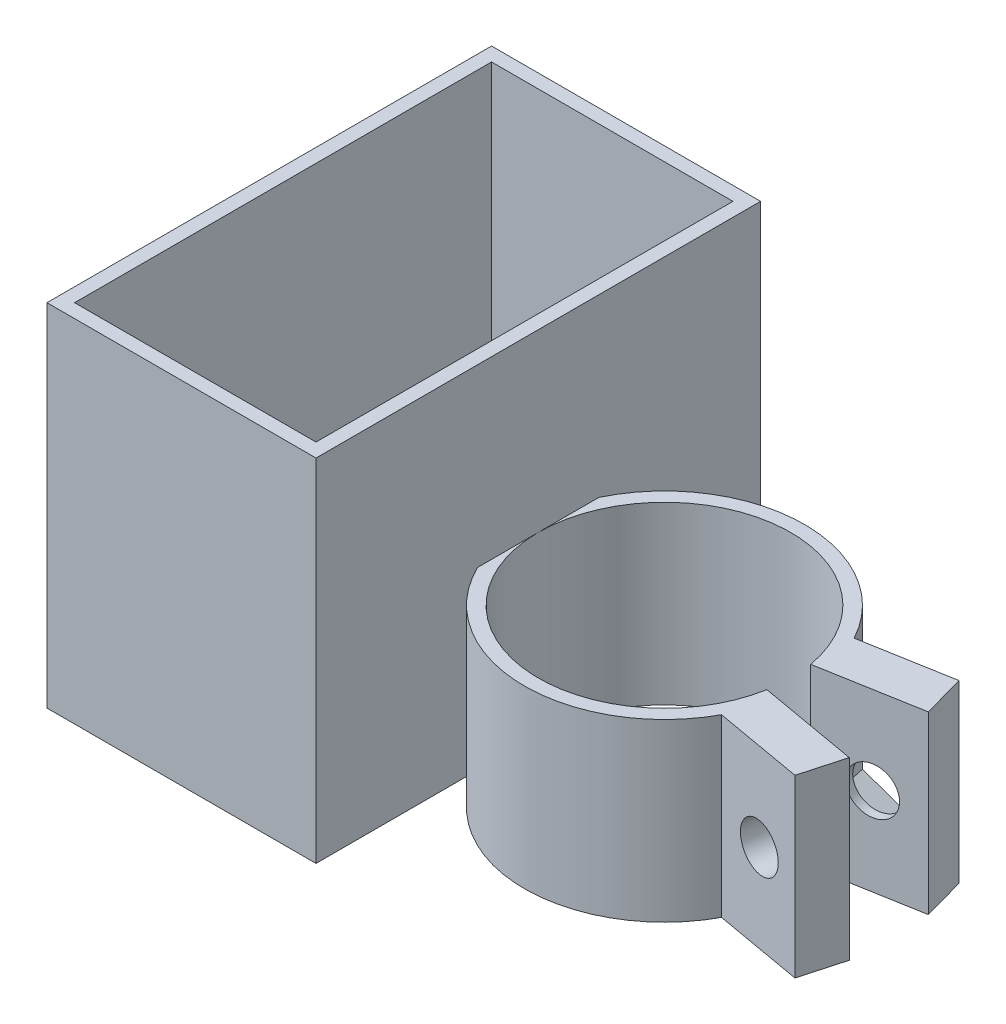
ISO-10303-21;
HEADER;
FILE_DESCRIPTION(('STEP AP214'),'2;1');
FILE_NAME('part.step','',(''),(''),'','','');
FILE_SCHEMA(('AUTOMOTIVE_DESIGN { 1 0 10303 214 1 1 1 1 }'));
ENDSEC;
DATA;
#1=APPLICATION_CONTEXT('core data for automotive mechanical design processes');
#2=APPLICATION_PROTOCOL_DEFINITION('international standard','automotive_design',2000,#1);
#3=PRODUCT_CONTEXT('',#1,'mechanical');
#4=PRODUCT('Part','Part','',(#3));
#5=PRODUCT_RELATED_PRODUCT_CATEGORY('part','',(#4));
#6=PRODUCT_DEFINITION_FORMATION('','',#4);
#7=PRODUCT_DEFINITION_CONTEXT('part definition',#1,'design');
#8=PRODUCT_DEFINITION('design','',#6,#7);
#9=PRODUCT_DEFINITION_SHAPE('','',#8);
#10=(LENGTH_UNIT() NAMED_UNIT(*) SI_UNIT(.MILLI.,.METRE.));
#11=(NAMED_UNIT(*) PLANE_ANGLE_UNIT() SI_UNIT($,.RADIAN.));
#12=(NAMED_UNIT(*) SI_UNIT($,.STERADIAN.) SOLID_ANGLE_UNIT());
#13=UNCERTAINTY_MEASURE_WITH_UNIT(LENGTH_MEASURE(1.E-05),#10,'distance_accuracy_value','');
#14=(GEOMETRIC_REPRESENTATION_CONTEXT(3) GLOBAL_UNCERTAINTY_ASSIGNED_CONTEXT((#13)) GLOBAL_UNIT_ASSIGNED_CONTEXT((#10,
#11,#12)) REPRESENTATION_CONTEXT('',''));
#15=CARTESIAN_POINT('',(0.,0.,0.));
#16=DIRECTION('',(0.,0.,1.));
#17=DIRECTION('',(1.,0.,0.));
#18=AXIS2_PLACEMENT_3D('',#15,#16,#17);
#19=CARTESIAN_POINT('',(-20.25625,50.8,-30.1625));
#20=DIRECTION('',(0.,0.,-1.));
#21=DIRECTION('',(-1.,0.,0.));
#22=AXIS2_PLACEMENT_3D('',#19,#20,#21);
#23=PLANE('',#22);
#24=DIRECTION('',(1.,0.,0.));
#25=VECTOR('',#24,1.);
#26=CARTESIAN_POINT('',(-55.18125,3.175,-30.1625));
#27=LINE('',#26,#25);
#28=CARTESIAN_POINT('',(-55.18125,3.175,-30.1625));
#29=VERTEX_POINT('',#28);
#30=CARTESIAN_POINT('',(-20.25625,3.175,-30.1625));
#31=VERTEX_POINT('',#30);
#32=EDGE_CURVE('E215',#29,#31,#27,.T.);
#33=ORIENTED_EDGE('',*,*,#32,.T.);
#34=DIRECTION('',(0.,-1.,0.));
#35=VECTOR('',#34,1.);
#36=CARTESIAN_POINT('',(-20.25625,50.8,-30.1625));
#37=LINE('',#36,#35);
#38=CARTESIAN_POINT('',(-20.25625,50.8,-30.1625));
#39=VERTEX_POINT('',#38);
#40=EDGE_CURVE('E200',#39,#31,#37,.T.);
#41=ORIENTED_EDGE('',*,*,#40,.F.);
#42=DIRECTION('',(1.,0.,0.));
#43=VECTOR('',#42,1.);
#44=CARTESIAN_POINT('',(-20.25625,50.8,-30.1625));
#45=LINE('',#44,#43);
#46=CARTESIAN_POINT('',(-55.18125,50.8,-30.1625));
#47=VERTEX_POINT('',#46);
#48=EDGE_CURVE('E272',#47,#39,#45,.T.);
#49=ORIENTED_EDGE('',*,*,#48,.F.);
#50=DIRECTION('',(0.,-1.,0.));
#51=VECTOR('',#50,1.);
#52=CARTESIAN_POINT('',(-55.18125,50.8,-30.1625));
#53=LINE('',#52,#51);
#54=EDGE_CURVE('E216',#47,#29,#53,.T.);
#55=ORIENTED_EDGE('',*,*,#54,.T.);
#56=EDGE_LOOP('',(#33,#41,#49,#55));
#57=FACE_BOUND('',#56,.T.);
#58=ADVANCED_FACE('F35',(#57),#23,.F.);
#59=CARTESIAN_POINT('',(-55.18125,50.8,-30.1625));
#60=DIRECTION('',(-1.,0.,0.));
#61=DIRECTION('',(0.,0.,1.));
#62=AXIS2_PLACEMENT_3D('',#59,#60,#61);
#63=PLANE('',#62);
#64=DIRECTION('',(0.,0.,-1.));
#65=VECTOR('',#64,1.);
#66=CARTESIAN_POINT('',(-55.18125,3.175,30.1625));
#67=LINE('',#66,#65);
#68=CARTESIAN_POINT('',(-55.18125,3.175,30.1625));
#69=VERTEX_POINT('',#68);
#70=EDGE_CURVE('E51',#69,#29,#67,.T.);
#71=ORIENTED_EDGE('',*,*,#70,.T.);
#72=ORIENTED_EDGE('',*,*,#54,.F.);
#73=DIRECTION('',(0.,0.,-1.));
#74=VECTOR('',#73,1.);
#75=CARTESIAN_POINT('',(-55.18125,50.8,-30.1625));
#76=LINE('',#75,#74);
#77=CARTESIAN_POINT('',(-55.18125,50.8,30.1625));
#78=VERTEX_POINT('',#77);
#79=EDGE_CURVE('E212',#78,#47,#76,.T.);
#80=ORIENTED_EDGE('',*,*,#79,.F.);
#81=DIRECTION('',(0.,-1.,0.));
#82=VECTOR('',#81,1.);
#83=CARTESIAN_POINT('',(-55.18125,50.8,30.1625));
#84=LINE('',#83,#82);
#85=EDGE_CURVE('E282',#78,#69,#84,.T.);
#86=ORIENTED_EDGE('',*,*,#85,.T.);
#87=EDGE_LOOP('',(#71,#72,#80,#86));
#88=FACE_BOUND('',#87,.T.);
#89=ADVANCED_FACE('F469',(#88),#63,.F.);
#90=CARTESIAN_POINT('',(-20.25625,50.8,30.1625));
#91=DIRECTION('',(0.,0.,1.));
#92=DIRECTION('',(1.,0.,0.));
#93=AXIS2_PLACEMENT_3D('',#90,#91,#92);
#94=PLANE('',#93);
#95=DIRECTION('',(-1.,0.,0.));
#96=VECTOR('',#95,1.);
#97=CARTESIAN_POINT('',(-20.25625,3.175,30.1625));
#98=LINE('',#97,#96);
#99=CARTESIAN_POINT('',(-20.25625,3.175,30.1625));
#100=VERTEX_POINT('',#99);
#101=EDGE_CURVE('E59',#100,#69,#98,.T.);
#102=ORIENTED_EDGE('',*,*,#101,.T.);
#103=ORIENTED_EDGE('',*,*,#85,.F.);
#104=DIRECTION('',(-1.,0.,0.));
#105=VECTOR('',#104,1.);
#106=CARTESIAN_POINT('',(-20.25625,50.8,30.1625));
#107=LINE('',#106,#105);
#108=CARTESIAN_POINT('',(-20.25625,50.8,30.1625));
#109=VERTEX_POINT('',#108);
#110=EDGE_CURVE('E275',#109,#78,#107,.T.);
#111=ORIENTED_EDGE('',*,*,#110,.F.);
#112=DIRECTION('',(0.,-1.,0.));
#113=VECTOR('',#112,1.);
#114=CARTESIAN_POINT('',(-20.25625,50.8,30.1625));
#115=LINE('',#114,#113);
#116=EDGE_CURVE('E211',#109,#100,#115,.T.);
#117=ORIENTED_EDGE('',*,*,#116,.T.);
#118=EDGE_LOOP('',(#102,#103,#111,#117));
#119=FACE_BOUND('',#118,.T.);
#120=ADVANCED_FACE('F474',(#119),#94,.F.);
#121=CARTESIAN_POINT('',(-20.25625,50.8,-30.1625));
#122=DIRECTION('',(1.,0.,0.));
#123=DIRECTION('',(0.,0.,-1.));
#124=AXIS2_PLACEMENT_3D('',#121,#122,#123);
#125=PLANE('',#124);
#126=DIRECTION('',(0.,0.,1.));
#127=VECTOR('',#126,1.);
#128=CARTESIAN_POINT('',(-20.25625,3.175,-30.1625));
#129=LINE('',#128,#127);
#130=EDGE_CURVE('E205',#31,#100,#129,.T.);
#131=ORIENTED_EDGE('',*,*,#130,.T.);
#132=ORIENTED_EDGE('',*,*,#116,.F.);
#133=DIRECTION('',(0.,0.,1.));
#134=VECTOR('',#133,1.);
#135=CARTESIAN_POINT('',(-20.25625,50.8,-30.1625));
#136=LINE('',#135,#134);
#137=EDGE_CURVE('E207',#39,#109,#136,.T.);
#138=ORIENTED_EDGE('',*,*,#137,.F.);
#139=ORIENTED_EDGE('',*,*,#40,.T.);
#140=EDGE_LOOP('',(#131,#132,#138,#139));
#141=FACE_BOUND('',#140,.T.);
#142=ADVANCED_FACE('F202',(#141),#125,.F.);
#143=CARTESIAN_POINT('',(30.0367584131233,12.7,20.6839281609609));
#144=DIRECTION('',(-0.173648177666931,0.,-0.984807753012208));
#145=DIRECTION('',(-0.984807753012208,0.,0.173648177666931));
#146=AXIS2_PLACEMENT_3D('',#143,#144,#145);
#147=CYLINDRICAL_SURFACE('',#146,3.3734375);
#148=CARTESIAN_POINT('',(25.5938792860573,12.7,-4.51289145912742));
#149=DIRECTION('',(-0.173648177666931,0.,-0.984807753012208));
#150=DIRECTION('',(-0.984807753012208,0.,0.173648177666931));
#151=AXIS2_PLACEMENT_3D('',#148,#149,#150);
#152=CIRCLE('',#151,3.3734375);
#153=CARTESIAN_POINT('',(22.2716918817551,12.7,-3.92710018477914));
#154=VERTEX_POINT('',#153);
#155=EDGE_CURVE('E327',#154,#154,#152,.F.);
#156=CARTESIAN_POINT('',(25.3733461004203,12.7,-5.76359730545292));
#157=DIRECTION('',(-0.173648177666931,0.,-0.984807753012208));
#158=DIRECTION('',(-0.984807753012208,0.,0.173648177666932));
#159=AXIS2_PLACEMENT_3D('',#156,#157,#158);
#160=CIRCLE('',#159,3.3734375);
#161=CARTESIAN_POINT('',(22.0511586961181,12.7,-5.17780603110463));
#162=VERTEX_POINT('',#161);
#163=EDGE_CURVE('E39',#162,#162,#160,.F.);
#164=CARTESIAN_POINT('',(22.2716918817551,12.7,-3.92710018477914));
#165=CARTESIAN_POINT('',(22.2693946610714,12.7,-3.94012837067836));
#166=CARTESIAN_POINT('',(22.2670974403877,12.7,-3.95315655657758));
#167=CARTESIAN_POINT('',(22.2625029990203,12.7,-3.97921292837603));
#168=CARTESIAN_POINT('',(22.2602057783365,12.7,-3.99224111427525));
#169=CARTESIAN_POINT('',(22.2556113369691,12.7,-4.0182974860737));
#170=CARTESIAN_POINT('',(22.2533141162854,12.7,-4.03132567197293));
#171=CARTESIAN_POINT('',(22.248719674918,12.7,-4.05738204377138));
#172=CARTESIAN_POINT('',(22.2464224542342,12.7,-4.0704102296706));
#173=CARTESIAN_POINT('',(22.2418280128668,12.7,-4.09646660146905));
#174=CARTESIAN_POINT('',(22.2395307921831,12.7,-4.10949478736827));
#175=CARTESIAN_POINT('',(22.2349363508156,12.7,-4.13555115916672));
#176=CARTESIAN_POINT('',(22.2326391301319,12.7,-4.14857934506594));
#177=CARTESIAN_POINT('',(22.2280446887645,12.7,-4.17463571686439));
#178=CARTESIAN_POINT('',(22.2257474680808,12.7,-4.18766390276361));
#179=CARTESIAN_POINT('',(22.2211530267133,12.7,-4.21372027456206));
#180=CARTESIAN_POINT('',(22.2188558060296,12.7,-4.22674846046129));
#181=CARTESIAN_POINT('',(22.2142613646622,12.7,-4.25280483225974));
#182=CARTESIAN_POINT('',(22.2119641439785,12.7,-4.26583301815896));
#183=CARTESIAN_POINT('',(22.207369702611,12.7,-4.29188938995741));
#184=CARTESIAN_POINT('',(22.2050724819273,12.7,-4.30491757585663));
#185=CARTESIAN_POINT('',(22.2004780405599,12.7,-4.33097394765508));
#186=CARTESIAN_POINT('',(22.1981808198761,12.7,-4.3440021335543));
#187=CARTESIAN_POINT('',(22.1935863785087,12.7,-4.37005850535275));
#188=CARTESIAN_POINT('',(22.191289157825,12.7,-4.38308669125197));
#189=CARTESIAN_POINT('',(22.1866947164575,12.7,-4.40914306305042));
#190=CARTESIAN_POINT('',(22.1843974957738,12.7,-4.42217124894965));
#191=CARTESIAN_POINT('',(22.1798030544064,12.7,-4.44822762074809));
#192=CARTESIAN_POINT('',(22.1775058337227,12.7,-4.46125580664732));
#193=CARTESIAN_POINT('',(22.1729113923552,12.7,-4.48731217844576));
#194=CARTESIAN_POINT('',(22.1706141716715,12.7,-4.50034036434499));
#195=CARTESIAN_POINT('',(22.1660197303041,12.7,-4.52639673614344));
#196=CARTESIAN_POINT('',(22.1637225096204,12.7,-4.53942492204266));
#197=CARTESIAN_POINT('',(22.1591280682529,12.7,-4.56548129384111));
#198=CARTESIAN_POINT('',(22.1568308475692,12.7,-4.57850947974033));
#199=CARTESIAN_POINT('',(22.1522364062018,12.7,-4.60456585153878));
#200=CARTESIAN_POINT('',(22.1499391855181,12.7,-4.617594037438));
#201=CARTESIAN_POINT('',(22.1453447441506,12.7,-4.64365040923645));
#202=CARTESIAN_POINT('',(22.1430475234669,12.7,-4.65667859513568));
#203=CARTESIAN_POINT('',(22.1384530820995,12.7,-4.68273496693412));
#204=CARTESIAN_POINT('',(22.1361558614157,12.7,-4.69576315283335));
#205=CARTESIAN_POINT('',(22.1315614200483,12.7,-4.72181952463179));
#206=CARTESIAN_POINT('',(22.1292641993646,12.7,-4.73484771053102));
#207=CARTESIAN_POINT('',(22.1246697579971,12.7,-4.76090408232947));
#208=CARTESIAN_POINT('',(22.1223725373134,12.7,-4.77393226822869));
#209=CARTESIAN_POINT('',(22.117778095946,12.7,-4.79998864002714));
#210=CARTESIAN_POINT('',(22.1154808752623,12.7,-4.81301682592636));
#211=CARTESIAN_POINT('',(22.1108864338948,12.7,-4.83907319772481));
#212=CARTESIAN_POINT('',(22.1085892132111,12.7,-4.85210138362403));
#213=CARTESIAN_POINT('',(22.1039947718437,12.7,-4.87815775542248));
#214=CARTESIAN_POINT('',(22.10169755116,12.7,-4.89118594132171));
#215=CARTESIAN_POINT('',(22.0971031097925,12.7,-4.91724231312015));
#216=CARTESIAN_POINT('',(22.0948058891088,12.7,-4.93027049901938));
#217=CARTESIAN_POINT('',(22.0902114477414,12.7,-4.95632687081783));
#218=CARTESIAN_POINT('',(22.0879142270576,12.7,-4.96935505671705));
#219=CARTESIAN_POINT('',(22.0833197856902,12.7,-4.9954114285155));
#220=CARTESIAN_POINT('',(22.0810225650065,12.7,-5.00843961441472));
#221=CARTESIAN_POINT('',(22.076428123639,12.7,-5.03449598621317));
#222=CARTESIAN_POINT('',(22.0741309029553,12.7,-5.04752417211239));
#223=CARTESIAN_POINT('',(22.0695364615879,12.7,-5.07358054391084));
#224=CARTESIAN_POINT('',(22.0672392409042,12.7,-5.08660872981006));
#225=CARTESIAN_POINT('',(22.0626447995367,12.7,-5.11266510160851));
#226=CARTESIAN_POINT('',(22.060347578853,12.7,-5.12569328750774));
#227=CARTESIAN_POINT('',(22.0557531374856,12.7,-5.15174965930619));
#228=CARTESIAN_POINT('',(22.0534559168019,12.7,-5.16477784520541));
#229=CARTESIAN_POINT('',(22.0511586961181,12.7,-5.17780603110463));
#230=B_SPLINE_CURVE_WITH_KNOTS('',3,(#164,#165,#166,#167,#168,#169,#170,#171,#172,#173,#174,
#175,#176,#177,#178,#179,#180,#181,#182,#183,#184,#185,#186,#187,#188,#189,#190,#191,#192,#193,
#194,#195,#196,#197,#198,#199,#200,#201,#202,#203,#204,#205,#206,#207,#208,#209,#210,#211,#212,
#213,#214,#215,#216,#217,#218,#219,#220,#221,#222,#223,#224,#225,#226,#227,#228,#229),
.UNSPECIFIED.,.F.,.F.,(4,2,2,2,2,2,2,2,2,2,2,2,2,2,2,2,2,2,2,2,2,2,2,2,2,2,2,2,2,2,2,2,4),(0.,
0.0396874999999995,0.0793749999999984,0.119062500000001,0.15875,0.198437499999999,
0.238124999999998,0.277812499999997,0.317499999999999,0.357187499999998,0.396874999999997,
0.436562499999996,0.476249999999999,0.515937499999998,0.555624999999997,0.595312499999996,
0.634999999999995,0.674687499999998,0.714374999999997,0.754062499999996,0.793749999999995,
0.833437499999997,0.873124999999996,0.912812499999995,0.952499999999994,0.992187499999994,
1.031875,1.0715625,1.11124999999999,1.15093749999999,1.19062499999999,1.2303125,
1.26999999999999),.UNSPECIFIED.);
#231=EDGE_CURVE('BSEAM493',#154,#162,#230,.T.);
#232=ORIENTED_EDGE('',*,*,#155,.T.);
#233=ORIENTED_EDGE('',*,*,#163,.F.);
#234=ORIENTED_EDGE('',*,*,#231,.T.);
#235=ORIENTED_EDGE('',*,*,#231,.F.);
#236=EDGE_LOOP('',(#232,#234,#233,#235));
#237=FACE_BOUND('',#236,.T.);
#238=ADVANCED_FACE('F493',(#237),#147,.F.);
#239=CARTESIAN_POINT('',(0.,25.4,0.));
#240=DIRECTION('',(0.,-1.,0.));
#241=DIRECTION('',(0.,0.,-1.));
#242=AXIS2_PLACEMENT_3D('',#239,#240,#241);
#243=CYLINDRICAL_SURFACE('',#242,20.25625);
#244=CARTESIAN_POINT('',(0.,0.,0.));
#245=DIRECTION('',(0.,1.,0.));
#246=DIRECTION('',(0.,0.,1.));
#247=AXIS2_PLACEMENT_3D('',#244,#245,#246);
#248=CIRCLE('',#247,20.25625);
#249=CARTESIAN_POINT('',(17.8403144349107,0.,-9.59368776467195));
#250=VERTEX_POINT('',#249);
#251=CARTESIAN_POINT('',(-18.25625,0.,-8.77638877899105));
#252=VERTEX_POINT('',#251);
#253=EDGE_CURVE('E364',#250,#252,#248,.T.);
#254=ORIENTED_EDGE('',*,*,#253,.T.);
#255=DIRECTION('',(0.,-1.,0.));
#256=VECTOR('',#255,1.);
#257=CARTESIAN_POINT('',(-18.25625,25.4,-8.77638877899105));
#258=LINE('',#257,#256);
#259=CARTESIAN_POINT('',(-18.25625,25.4,-8.77638877899105));
#260=VERTEX_POINT('',#259);
#261=EDGE_CURVE('E322',#252,#260,#258,.F.);
#262=ORIENTED_EDGE('',*,*,#261,.T.);
#263=CARTESIAN_POINT('',(0.,25.4,0.));
#264=DIRECTION('',(0.,1.,0.));
#265=DIRECTION('',(0.,0.,1.));
#266=AXIS2_PLACEMENT_3D('',#263,#264,#265);
#267=CIRCLE('',#266,20.25625);
#268=CARTESIAN_POINT('',(17.8403144349107,25.4,-9.59368776467195));
#269=VERTEX_POINT('',#268);
#270=EDGE_CURVE('E342',#269,#260,#267,.T.);
#271=ORIENTED_EDGE('',*,*,#270,.F.);
#272=DIRECTION('',(0.,-1.,0.));
#273=VECTOR('',#272,1.);
#274=CARTESIAN_POINT('',(17.8403144349107,25.4,-9.59368776467195));
#275=LINE('',#274,#273);
#276=EDGE_CURVE('E11',#269,#250,#275,.T.);
#277=ORIENTED_EDGE('',*,*,#276,.T.);
#278=EDGE_LOOP('',(#254,#262,#271,#277));
#279=FACE_BOUND('',#278,.T.);
#280=ADVANCED_FACE('F438',(#279),#243,.T.);
#281=CARTESIAN_POINT('',(0.,25.4,0.));
#282=DIRECTION('',(0.,1.,0.));
#283=DIRECTION('',(0.,0.,1.));
#284=AXIS2_PLACEMENT_3D('',#281,#282,#283);
#285=PLANE('',#284);
#286=DIRECTION('',(0.,0.,-1.));
#287=VECTOR('',#286,1.);
#288=CARTESIAN_POINT('',(-18.25625,25.4,0.));
#289=LINE('',#288,#287);
#290=CARTESIAN_POINT('',(-18.25625,25.4,8.77638877899105));
#291=VERTEX_POINT('',#290);
#292=CARTESIAN_POINT('',(-18.25625,25.4,0.));
#293=VERTEX_POINT('',#292);
#294=EDGE_CURVE('E321',#291,#293,#289,.T.);
#295=ORIENTED_EDGE('',*,*,#294,.F.);
#296=CARTESIAN_POINT('',(17.8403144349107,25.4,9.59368776467195));
#297=VERTEX_POINT('',#296);
#298=EDGE_CURVE('E340',#291,#297,#267,.T.);
#299=ORIENTED_EDGE('',*,*,#298,.T.);
#300=DIRECTION('',(-0.984807753012208,0.,-0.173648177666931));
#301=VECTOR('',#300,1.);
#302=CARTESIAN_POINT('',(-1.10266592818501,25.4,6.25352923162753));
#303=LINE('',#302,#301);
#304=CARTESIAN_POINT('',(30.7447425894998,25.4,11.8690866189399));
#305=VERTEX_POINT('',#304);
#306=EDGE_CURVE('E344',#305,#297,#303,.T.);
#307=ORIENTED_EDGE('',*,*,#306,.F.);
#308=DIRECTION('',(0.268156623818466,0.,-0.963375329299169));
#309=VECTOR('',#308,1.);
#310=CARTESIAN_POINT('',(31.6001565498542,25.4,8.79593968708785));
#311=LINE('',#310,#309);
#312=CARTESIAN_POINT('',(32.4555705102086,25.4,5.72279275523579));
#313=VERTEX_POINT('',#312);
#314=EDGE_CURVE('E347',#305,#313,#311,.T.);
#315=ORIENTED_EDGE('',*,*,#314,.T.);
#316=DIRECTION('',(0.984807753012208,0.,0.173648177666931));
#317=VECTOR('',#316,1.);
#318=CARTESIAN_POINT('',(0.,25.4,0.));
#319=LINE('',#318,#317);
#320=CARTESIAN_POINT('',(17.9788965409291,25.4,3.1701645435319));
#321=VERTEX_POINT('',#320);
#322=EDGE_CURVE('E349',#321,#313,#319,.T.);
#323=ORIENTED_EDGE('',*,*,#322,.F.);
#324=CARTESIAN_POINT('',(0.,25.4,0.));
#325=DIRECTION('',(0.,1.,0.));
#326=DIRECTION('',(0.,0.,1.));
#327=AXIS2_PLACEMENT_3D('',#324,#325,#326);
#328=CIRCLE('',#327,18.25625);
#329=EDGE_CURVE('E352',#293,#321,#328,.T.);
#330=ORIENTED_EDGE('',*,*,#329,.F.);
#331=EDGE_LOOP('',(#295,#299,#307,#315,#323,#330));
#332=FACE_BOUND('',#331,.T.);
#333=ADVANCED_FACE('F414',(#332),#285,.T.);
#334=CARTESIAN_POINT('',(-1.10266592818501,25.4,-6.25352923162751));
#335=DIRECTION('',(0.173648177666932,0.,0.984807753012208));
#336=DIRECTION('',(0.984807753012208,0.,-0.173648177666932));
#337=AXIS2_PLACEMENT_3D('',#334,#335,#336);
#338=PLANE('',#337);
#339=DIRECTION('',(0.,1.,0.));
#340=VECTOR('',#339,1.);
#341=CARTESIAN_POINT('',(18.8630370494075,9.40044321158129,-9.77402135538843));
#342=LINE('',#341,#340);
#343=CARTESIAN_POINT('',(18.8630370494075,9.40044321158129,-9.77402135538843));
#344=VERTEX_POINT('',#343);
#345=CARTESIAN_POINT('',(18.8630370494075,15.9995567884187,-9.77402135538843));
#346=VERTEX_POINT('',#345);
#347=EDGE_CURVE('E226',#344,#346,#342,.T.);
#348=ORIENTED_EDGE('',*,*,#347,.F.);
#349=DIRECTION('',(-0.852868531952443,0.5,0.150383733180436));
#350=VECTOR('',#349,1.);
#351=CARTESIAN_POINT('',(24.4912133578722,6.10088642316258,-10.7664206907549));
#352=LINE('',#351,#350);
#353=CARTESIAN_POINT('',(24.4912133578722,6.10088642316258,-10.7664206907549));
#354=VERTEX_POINT('',#353);
#355=EDGE_CURVE('E224',#354,#344,#352,.T.);
#356=ORIENTED_EDGE('',*,*,#355,.F.);
#357=DIRECTION('',(-0.852868531952443,-0.5,0.150383733180436));
#358=VECTOR('',#357,1.);
#359=CARTESIAN_POINT('',(30.119389666337,9.4004432115813,-11.7588200261215));
#360=LINE('',#359,#358);
#361=CARTESIAN_POINT('',(30.119389666337,9.4004432115813,-11.7588200261215));
#362=VERTEX_POINT('',#361);
#363=EDGE_CURVE('E238',#362,#354,#360,.T.);
#364=ORIENTED_EDGE('',*,*,#363,.F.);
#365=DIRECTION('',(0.,-1.,0.));
#366=VECTOR('',#365,1.);
#367=CARTESIAN_POINT('',(30.119389666337,15.9995567884187,-11.7588200261215));
#368=LINE('',#367,#366);
#369=CARTESIAN_POINT('',(30.119389666337,15.9995567884187,-11.7588200261215));
#370=VERTEX_POINT('',#369);
#371=EDGE_CURVE('E235',#370,#362,#368,.T.);
#372=ORIENTED_EDGE('',*,*,#371,.F.);
#373=DIRECTION('',(0.852868531952443,-0.5,-0.150383733180436));
#374=VECTOR('',#373,1.);
#375=CARTESIAN_POINT('',(24.4912133578723,19.2991135768374,-10.7664206907549));
#376=LINE('',#375,#374);
#377=CARTESIAN_POINT('',(24.4912133578723,19.2991135768374,-10.7664206907549));
#378=VERTEX_POINT('',#377);
#379=EDGE_CURVE('E232',#378,#370,#376,.T.);
#380=ORIENTED_EDGE('',*,*,#379,.F.);
#381=DIRECTION('',(0.852868531952443,0.5,-0.150383733180436));
#382=VECTOR('',#381,1.);
#383=CARTESIAN_POINT('',(18.8630370494075,15.9995567884187,-9.77402135538843));
#384=LINE('',#383,#382);
#385=EDGE_CURVE('E229',#346,#378,#384,.T.);
#386=ORIENTED_EDGE('',*,*,#385,.F.);
#387=EDGE_LOOP('',(#348,#356,#364,#372,#380,#386));
#388=FACE_BOUND('',#387,.T.);
#389=DIRECTION('',(-0.984807753012208,0.,0.173648177666932));
#390=VECTOR('',#389,1.);
#391=CARTESIAN_POINT('',(-1.10266592818501,0.,-6.25352923162751));
#392=LINE('',#391,#390);
#393=CARTESIAN_POINT('',(30.7447425894998,0.,-11.86908661894));
#394=VERTEX_POINT('',#393);
#395=EDGE_CURVE('E336',#394,#250,#392,.T.);
#396=ORIENTED_EDGE('',*,*,#395,.T.);
#397=ORIENTED_EDGE('',*,*,#276,.F.);
#398=DIRECTION('',(-0.984807753012208,0.,0.173648177666932));
#399=VECTOR('',#398,1.);
#400=CARTESIAN_POINT('',(-1.10266592818501,25.4,-6.25352923162751));
#401=LINE('',#400,#399);
#402=CARTESIAN_POINT('',(30.7447425894998,25.4,-11.86908661894));
#403=VERTEX_POINT('',#402);
#404=EDGE_CURVE('E337',#403,#269,#401,.T.);
#405=ORIENTED_EDGE('',*,*,#404,.F.);
#406=DIRECTION('',(0.,-1.,0.));
#407=VECTOR('',#406,1.);
#408=CARTESIAN_POINT('',(30.7447425894998,25.4,-11.86908661894));
#409=LINE('',#408,#407);
#410=EDGE_CURVE('E360',#403,#394,#409,.T.);
#411=ORIENTED_EDGE('',*,*,#410,.T.);
#412=EDGE_LOOP('',(#396,#397,#405,#411));
#413=FACE_BOUND('',#412,.T.);
#414=ADVANCED_FACE('F37',(#388,#413),#338,.F.);
#415=ORIENTED_EDGE('',*,*,#298,.F.);
#416=DIRECTION('',(0.,-1.,0.));
#417=VECTOR('',#416,1.);
#418=CARTESIAN_POINT('',(-18.25625,25.4,8.77638877899105));
#419=LINE('',#418,#417);
#420=CARTESIAN_POINT('',(-18.25625,0.,8.77638877899105));
#421=VERTEX_POINT('',#420);
#422=EDGE_CURVE('E325',#291,#421,#419,.T.);
#423=ORIENTED_EDGE('',*,*,#422,.T.);
#424=CARTESIAN_POINT('',(17.8403144349107,0.,9.59368776467195));
#425=VERTEX_POINT('',#424);
#426=EDGE_CURVE('E363',#421,#425,#248,.T.);
#427=ORIENTED_EDGE('',*,*,#426,.T.);
#428=DIRECTION('',(0.,-1.,0.));
#429=VECTOR('',#428,1.);
#430=CARTESIAN_POINT('',(17.8403144349107,25.4,9.59368776467195));
#431=LINE('',#430,#429);
#432=EDGE_CURVE('E44',#297,#425,#431,.T.);
#433=ORIENTED_EDGE('',*,*,#432,.F.);
#434=EDGE_LOOP('',(#415,#423,#427,#433));
#435=FACE_BOUND('',#434,.T.);
#436=ADVANCED_FACE('F418',(#435),#243,.T.);
#437=CARTESIAN_POINT('',(-1.10266592818501,25.4,6.25352923162753));
#438=DIRECTION('',(-0.173648177666931,0.,0.984807753012208));
#439=DIRECTION('',(0.984807753012208,0.,0.173648177666931));
#440=AXIS2_PLACEMENT_3D('',#437,#438,#439);
#441=PLANE('',#440);
#442=CARTESIAN_POINT('',(24.4912133578722,12.7,10.7664206907549));
#443=DIRECTION('',(-0.17364817766693,0.,0.984807753012208));
#444=DIRECTION('',(0.984807753012208,0.,0.17364817766693));
#445=AXIS2_PLACEMENT_3D('',#442,#443,#444);
#446=CIRCLE('',#445,3.3734375);
#447=CARTESIAN_POINT('',(27.8134007621744,12.7,11.3522119651032));
#448=VERTEX_POINT('',#447);
#449=EDGE_CURVE('E333',#448,#448,#446,.T.);
#450=ORIENTED_EDGE('',*,*,#449,.F.);
#451=EDGE_LOOP('',(#450));
#452=FACE_BOUND('',#451,.T.);
#453=DIRECTION('',(-0.984807753012208,0.,-0.173648177666931));
#454=VECTOR('',#453,1.);
#455=CARTESIAN_POINT('',(-1.10266592818501,0.,6.25352923162753));
#456=LINE('',#455,#454);
#457=CARTESIAN_POINT('',(30.7447425894998,0.,11.8690866189399));
#458=VERTEX_POINT('',#457);
#459=EDGE_CURVE('E366',#458,#425,#456,.T.);
#460=ORIENTED_EDGE('',*,*,#459,.F.);
#461=DIRECTION('',(0.,-1.,0.));
#462=VECTOR('',#461,1.);
#463=CARTESIAN_POINT('',(30.7447425894998,25.4,11.8690866189399));
#464=LINE('',#463,#462);
#465=EDGE_CURVE('E392',#305,#458,#464,.T.);
#466=ORIENTED_EDGE('',*,*,#465,.F.);
#467=ORIENTED_EDGE('',*,*,#306,.T.);
#468=ORIENTED_EDGE('',*,*,#432,.T.);
#469=EDGE_LOOP('',(#460,#466,#467,#468));
#470=FACE_BOUND('',#469,.T.);
#471=ADVANCED_FACE('F398',(#452,#470),#441,.T.);
#472=CARTESIAN_POINT('',(31.6001565498542,25.4,8.79593968708785));
#473=DIRECTION('',(-0.963375329299168,0.,-0.268156623818466));
#474=DIRECTION('',(-0.268156623818466,0.,0.963375329299169));
#475=AXIS2_PLACEMENT_3D('',#472,#473,#474);
#476=PLANE('',#475);
#477=DIRECTION('',(0.268156623818466,0.,-0.963375329299169));
#478=VECTOR('',#477,1.);
#479=CARTESIAN_POINT('',(31.6001565498542,0.,8.79593968708785));
#480=LINE('',#479,#478);
#481=CARTESIAN_POINT('',(32.4555705102086,0.,5.72279275523579));
#482=VERTEX_POINT('',#481);
#483=EDGE_CURVE('E369',#458,#482,#480,.T.);
#484=ORIENTED_EDGE('',*,*,#483,.T.);
#485=DIRECTION('',(0.,-1.,0.));
#486=VECTOR('',#485,1.);
#487=CARTESIAN_POINT('',(32.4555705102086,25.4,5.72279275523579));
#488=LINE('',#487,#486);
#489=EDGE_CURVE('E390',#313,#482,#488,.T.);
#490=ORIENTED_EDGE('',*,*,#489,.F.);
#491=ORIENTED_EDGE('',*,*,#314,.F.);
#492=ORIENTED_EDGE('',*,*,#465,.T.);
#493=EDGE_LOOP('',(#484,#490,#491,#492));
#494=FACE_BOUND('',#493,.T.);
#495=ADVANCED_FACE('F410',(#494),#476,.F.);
#496=CARTESIAN_POINT('',(0.,25.4,0.));
#497=DIRECTION('',(0.173648177666931,0.,-0.984807753012208));
#498=DIRECTION('',(-0.984807753012208,0.,-0.173648177666931));
#499=AXIS2_PLACEMENT_3D('',#496,#497,#498);
#500=PLANE('',#499);
#501=CARTESIAN_POINT('',(25.5938792860572,12.7,4.51289145912741));
#502=DIRECTION('',(0.173648177666931,0.,-0.984807753012208));
#503=DIRECTION('',(-0.984807753012208,0.,-0.173648177666931));
#504=AXIS2_PLACEMENT_3D('',#501,#502,#503);
#505=CIRCLE('',#504,3.3734375);
#506=CARTESIAN_POINT('',(28.9160666903594,12.7,5.09868273347569));
#507=VERTEX_POINT('',#506);
#508=EDGE_CURVE('E330',#507,#507,#505,.F.);
#509=ORIENTED_EDGE('',*,*,#508,.T.);
#510=EDGE_LOOP('',(#509));
#511=FACE_BOUND('',#510,.T.);
#512=DIRECTION('',(0.984807753012208,0.,0.173648177666931));
#513=VECTOR('',#512,1.);
#514=CARTESIAN_POINT('',(0.,0.,0.));
#515=LINE('',#514,#513);
#516=CARTESIAN_POINT('',(17.9788965409291,0.,3.1701645435319));
#517=VERTEX_POINT('',#516);
#518=EDGE_CURVE('E372',#517,#482,#515,.T.);
#519=ORIENTED_EDGE('',*,*,#518,.F.);
#520=DIRECTION('',(0.,-1.,0.));
#521=VECTOR('',#520,1.);
#522=CARTESIAN_POINT('',(17.9788965409291,25.4,3.1701645435319));
#523=LINE('',#522,#521);
#524=EDGE_CURVE('E387',#321,#517,#523,.T.);
#525=ORIENTED_EDGE('',*,*,#524,.F.);
#526=ORIENTED_EDGE('',*,*,#322,.T.);
#527=ORIENTED_EDGE('',*,*,#489,.T.);
#528=EDGE_LOOP('',(#519,#525,#526,#527));
#529=FACE_BOUND('',#528,.T.);
#530=ADVANCED_FACE('F458',(#511,#529),#500,.T.);
#531=CARTESIAN_POINT('',(0.,25.4,0.));
#532=DIRECTION('',(0.,-1.,0.));
#533=DIRECTION('',(0.,0.,-1.));
#534=AXIS2_PLACEMENT_3D('',#531,#532,#533);
#535=CYLINDRICAL_SURFACE('',#534,18.25625);
#536=ORIENTED_EDGE('',*,*,#524,.T.);
#537=CARTESIAN_POINT('',(0.,0.,0.));
#538=DIRECTION('',(0.,1.,0.));
#539=DIRECTION('',(0.,0.,1.));
#540=AXIS2_PLACEMENT_3D('',#537,#538,#539);
#541=CIRCLE('',#540,18.25625);
#542=CARTESIAN_POINT('',(17.9788965409291,0.,-3.17016454353191));
#543=VERTEX_POINT('',#542);
#544=EDGE_CURVE('E375',#543,#517,#541,.T.);
#545=ORIENTED_EDGE('',*,*,#544,.F.);
#546=DIRECTION('',(0.,-1.,0.));
#547=VECTOR('',#546,1.);
#548=CARTESIAN_POINT('',(17.9788965409291,25.4,-3.17016454353191));
#549=LINE('',#548,#547);
#550=CARTESIAN_POINT('',(17.9788965409291,25.4,-3.17016454353191));
#551=VERTEX_POINT('',#550);
#552=EDGE_CURVE('E385',#551,#543,#549,.T.);
#553=ORIENTED_EDGE('',*,*,#552,.F.);
#554=EDGE_CURVE('E353',#551,#293,#328,.T.);
#555=ORIENTED_EDGE('',*,*,#554,.T.);
#556=ORIENTED_EDGE('',*,*,#329,.T.);
#557=EDGE_LOOP('',(#536,#545,#553,#555,#556));
#558=FACE_BOUND('',#557,.T.);
#559=ADVANCED_FACE('F455',(#558),#535,.F.);
#560=CARTESIAN_POINT('',(0.,25.4,0.));
#561=DIRECTION('',(-0.173648177666931,0.,-0.984807753012208));
#562=DIRECTION('',(-0.984807753012208,0.,0.173648177666931));
#563=AXIS2_PLACEMENT_3D('',#560,#561,#562);
#564=PLANE('',#563);
#565=ORIENTED_EDGE('',*,*,#155,.F.);
#566=EDGE_LOOP('',(#565));
#567=FACE_BOUND('',#566,.T.);
#568=DIRECTION('',(0.984807753012208,0.,-0.173648177666931));
#569=VECTOR('',#568,1.);
#570=CARTESIAN_POINT('',(0.,0.,0.));
#571=LINE('',#570,#569);
#572=CARTESIAN_POINT('',(32.4555705102086,0.,-5.7227927552358));
#573=VERTEX_POINT('',#572);
#574=EDGE_CURVE('E377',#543,#573,#571,.T.);
#575=ORIENTED_EDGE('',*,*,#574,.T.);
#576=DIRECTION('',(0.,-1.,0.));
#577=VECTOR('',#576,1.);
#578=CARTESIAN_POINT('',(32.4555705102086,25.4,-5.7227927552358));
#579=LINE('',#578,#577);
#580=CARTESIAN_POINT('',(32.4555705102086,25.4,-5.7227927552358));
#581=VERTEX_POINT('',#580);
#582=EDGE_CURVE('E382',#581,#573,#579,.T.);
#583=ORIENTED_EDGE('',*,*,#582,.F.);
#584=DIRECTION('',(0.984807753012208,0.,-0.173648177666931));
#585=VECTOR('',#584,1.);
#586=CARTESIAN_POINT('',(0.,25.4,0.));
#587=LINE('',#586,#585);
#588=EDGE_CURVE('E356',#551,#581,#587,.T.);
#589=ORIENTED_EDGE('',*,*,#588,.F.);
#590=ORIENTED_EDGE('',*,*,#552,.T.);
#591=EDGE_LOOP('',(#575,#583,#589,#590));
#592=FACE_BOUND('',#591,.T.);
#593=ADVANCED_FACE('F452',(#567,#592),#564,.F.);
#594=CARTESIAN_POINT('',(31.6001565498542,25.4,-8.79593968708788));
#595=DIRECTION('',(-0.963375329299168,0.,0.268156623818467));
#596=DIRECTION('',(0.268156623818467,0.,0.963375329299169));
#597=AXIS2_PLACEMENT_3D('',#594,#595,#596);
#598=PLANE('',#597);
#599=DIRECTION('',(-0.268156623818467,0.,-0.963375329299168));
#600=VECTOR('',#599,1.);
#601=CARTESIAN_POINT('',(31.6001565498542,0.,-8.79593968708788));
#602=LINE('',#601,#600);
#603=EDGE_CURVE('E341',#573,#394,#602,.T.);
#604=ORIENTED_EDGE('',*,*,#603,.T.);
#605=ORIENTED_EDGE('',*,*,#410,.F.);
#606=DIRECTION('',(-0.268156623818467,0.,-0.963375329299168));
#607=VECTOR('',#606,1.);
#608=CARTESIAN_POINT('',(31.6001565498542,25.4,-8.79593968708788));
#609=LINE('',#608,#607);
#610=EDGE_CURVE('E358',#581,#403,#609,.T.);
#611=ORIENTED_EDGE('',*,*,#610,.F.);
#612=ORIENTED_EDGE('',*,*,#582,.T.);
#613=EDGE_LOOP('',(#604,#605,#611,#612));
#614=FACE_BOUND('',#613,.T.);
#615=ADVANCED_FACE('F447',(#614),#598,.F.);
#616=EDGE_CURVE('E312',#293,#260,#289,.T.);
#617=ORIENTED_EDGE('',*,*,#616,.F.);
#618=ORIENTED_EDGE('',*,*,#554,.F.);
#619=ORIENTED_EDGE('',*,*,#588,.T.);
#620=ORIENTED_EDGE('',*,*,#610,.T.);
#621=ORIENTED_EDGE('',*,*,#404,.T.);
#622=ORIENTED_EDGE('',*,*,#270,.T.);
#623=EDGE_LOOP('',(#617,#618,#619,#620,#621,#622));
#624=FACE_BOUND('',#623,.T.);
#625=ADVANCED_FACE('F500',(#624),#285,.T.);
#626=CARTESIAN_POINT('',(0.,0.,0.));
#627=DIRECTION('',(0.,1.,0.));
#628=DIRECTION('',(0.,0.,1.));
#629=AXIS2_PLACEMENT_3D('',#626,#627,#628);
#630=PLANE('',#629);
#631=ORIENTED_EDGE('',*,*,#426,.F.);
#632=DIRECTION('',(0.,0.,1.));
#633=VECTOR('',#632,1.);
#634=CARTESIAN_POINT('',(-18.25625,0.,-32.1625));
#635=LINE('',#634,#633);
#636=CARTESIAN_POINT('',(-18.25625,0.,32.1625));
#637=VERTEX_POINT('',#636);
#638=EDGE_CURVE('E281',#421,#637,#635,.T.);
#639=ORIENTED_EDGE('',*,*,#638,.T.);
#640=DIRECTION('',(-1.,0.,0.));
#641=VECTOR('',#640,1.);
#642=CARTESIAN_POINT('',(-18.25625,0.,32.1625));
#643=LINE('',#642,#641);
#644=CARTESIAN_POINT('',(-57.18125,0.,32.1625));
#645=VERTEX_POINT('',#644);
#646=EDGE_CURVE('E302',#637,#645,#643,.T.);
#647=ORIENTED_EDGE('',*,*,#646,.T.);
#648=DIRECTION('',(0.,0.,-1.));
#649=VECTOR('',#648,1.);
#650=CARTESIAN_POINT('',(-57.18125,0.,-32.1625));
#651=LINE('',#650,#649);
#652=CARTESIAN_POINT('',(-57.18125,0.,-32.1625));
#653=VERTEX_POINT('',#652);
#654=EDGE_CURVE('E305',#645,#653,#651,.T.);
#655=ORIENTED_EDGE('',*,*,#654,.T.);
#656=DIRECTION('',(1.,0.,0.));
#657=VECTOR('',#656,1.);
#658=CARTESIAN_POINT('',(-18.25625,0.,-32.1625));
#659=LINE('',#658,#657);
#660=CARTESIAN_POINT('',(-18.25625,0.,-32.1625));
#661=VERTEX_POINT('',#660);
#662=EDGE_CURVE('E289',#653,#661,#659,.T.);
#663=ORIENTED_EDGE('',*,*,#662,.T.);
#664=EDGE_CURVE('E299',#661,#252,#635,.T.);
#665=ORIENTED_EDGE('',*,*,#664,.T.);
#666=ORIENTED_EDGE('',*,*,#253,.F.);
#667=ORIENTED_EDGE('',*,*,#395,.F.);
#668=ORIENTED_EDGE('',*,*,#603,.F.);
#669=ORIENTED_EDGE('',*,*,#574,.F.);
#670=ORIENTED_EDGE('',*,*,#544,.T.);
#671=ORIENTED_EDGE('',*,*,#518,.T.);
#672=ORIENTED_EDGE('',*,*,#483,.F.);
#673=ORIENTED_EDGE('',*,*,#459,.T.);
#674=EDGE_LOOP('',(#631,#639,#647,#655,#663,#665,#666,#667,#668,#669,#670,#671,#672,#673));
#675=FACE_BOUND('',#674,.T.);
#676=ADVANCED_FACE('F405',(#675),#630,.F.);
#677=CARTESIAN_POINT('',(30.0367584131232,12.7,-20.6839281609609));
#678=DIRECTION('',(-0.17364817766693,0.,0.984807753012208));
#679=DIRECTION('',(0.984807753012208,0.,0.17364817766693));
#680=AXIS2_PLACEMENT_3D('',#677,#678,#679);
#681=CYLINDRICAL_SURFACE('',#680,3.3734375);
#682=CARTESIAN_POINT('',(28.9160666903594,12.7,5.09868273347569));
#683=CARTESIAN_POINT('',(28.9045805869408,12.7,5.16382366297181));
#684=CARTESIAN_POINT('',(28.8930944835222,12.7,5.22896459246793));
#685=CARTESIAN_POINT('',(28.870122276685,12.7,5.35924645146017));
#686=CARTESIAN_POINT('',(28.8586361732664,12.7,5.42438738095629));
#687=CARTESIAN_POINT('',(28.8356639664292,12.7,5.55466923994853));
#688=CARTESIAN_POINT('',(28.8241778630106,12.7,5.61981016944465));
#689=CARTESIAN_POINT('',(28.8012056561734,12.7,5.75009202843689));
#690=CARTESIAN_POINT('',(28.7897195527548,12.7,5.81523295793301));
#691=CARTESIAN_POINT('',(28.7667473459176,12.7,5.94551481692525));
#692=CARTESIAN_POINT('',(28.755261242499,12.7,6.01065574642137));
#693=CARTESIAN_POINT('',(28.7322890356619,12.7,6.14093760541361));
#694=CARTESIAN_POINT('',(28.7208029322433,12.7,6.20607853490973));
#695=CARTESIAN_POINT('',(28.6978307254061,12.7,6.33636039390197));
#696=CARTESIAN_POINT('',(28.6863446219875,12.7,6.40150132339809));
#697=CARTESIAN_POINT('',(28.6633724151503,12.7,6.53178318239033));
#698=CARTESIAN_POINT('',(28.6518863117317,12.7,6.59692411188645));
#699=CARTESIAN_POINT('',(28.6289141048945,12.7,6.72720597087869));
#700=CARTESIAN_POINT('',(28.6174280014759,12.7,6.79234690037481));
#701=CARTESIAN_POINT('',(28.5944557946387,12.7,6.92262875936705));
#702=CARTESIAN_POINT('',(28.5829696912201,12.7,6.98776968886317));
#703=CARTESIAN_POINT('',(28.559997484383,12.7,7.11805154785541));
#704=CARTESIAN_POINT('',(28.5485113809644,12.7,7.18319247735153));
#705=CARTESIAN_POINT('',(28.5255391741272,12.7,7.31347433634377));
#706=CARTESIAN_POINT('',(28.5140530707086,12.7,7.37861526583989));
#707=CARTESIAN_POINT('',(28.4910808638714,12.7,7.50889712483213));
#708=CARTESIAN_POINT('',(28.4795947604528,12.7,7.57403805432825));
#709=CARTESIAN_POINT('',(28.4566225536156,12.7,7.70431991332049));
#710=CARTESIAN_POINT('',(28.445136450197,12.7,7.76946084281661));
#711=CARTESIAN_POINT('',(28.4221642433598,12.7,7.89974270180885));
#712=CARTESIAN_POINT('',(28.4106781399412,12.7,7.96488363130497));
#713=CARTESIAN_POINT('',(28.387705933104,12.7,8.09516549029721));
#714=CARTESIAN_POINT('',(28.3762198296855,12.7,8.16030641979333));
#715=CARTESIAN_POINT('',(28.3532476228483,12.7,8.29058827878557));
#716=CARTESIAN_POINT('',(28.3417615194297,12.7,8.35572920828169));
#717=CARTESIAN_POINT('',(28.3187893125925,12.7,8.48601106727393));
#718=CARTESIAN_POINT('',(28.3073032091739,12.7,8.55115199677005));
#719=CARTESIAN_POINT('',(28.2843310023367,12.7,8.68143385576229));
#720=CARTESIAN_POINT('',(28.2728448989181,12.7,8.74657478525841));
#721=CARTESIAN_POINT('',(28.2498726920809,12.7,8.87685664425065));
#722=CARTESIAN_POINT('',(28.2383865886623,12.7,8.94199757374677));
#723=CARTESIAN_POINT('',(28.2154143818251,12.7,9.07227943273901));
#724=CARTESIAN_POINT('',(28.2039282784065,12.7,9.13742036223513));
#725=CARTESIAN_POINT('',(28.1809560715694,12.7,9.26770222122737));
#726=CARTESIAN_POINT('',(28.1694699681508,12.7,9.33284315072349));
#727=CARTESIAN_POINT('',(28.1464977613136,12.7,9.46312500971573));
#728=CARTESIAN_POINT('',(28.135011657895,12.7,9.52826593921185));
#729=CARTESIAN_POINT('',(28.1120394510578,12.7,9.65854779820409));
#730=CARTESIAN_POINT('',(28.1005533476392,12.7,9.72368872770021));
#731=CARTESIAN_POINT('',(28.077581140802,12.7,9.85397058669245));
#732=CARTESIAN_POINT('',(28.0660950373834,12.7,9.91911151618857));
#733=CARTESIAN_POINT('',(28.0431228305462,12.7,10.0493933751808));
#734=CARTESIAN_POINT('',(28.0316367271276,12.7,10.1145343046769));
#735=CARTESIAN_POINT('',(28.0086645202904,12.7,10.2448161636692));
#736=CARTESIAN_POINT('',(27.9971784168719,12.7,10.3099570931653));
#737=CARTESIAN_POINT('',(27.9742062100347,12.7,10.4402389521575));
#738=CARTESIAN_POINT('',(27.9627201066161,12.7,10.5053798816536));
#739=CARTESIAN_POINT('',(27.9397478997789,12.7,10.6356617406459));
#740=CARTESIAN_POINT('',(27.9282617963603,12.7,10.700802670142));
#741=CARTESIAN_POINT('',(27.9052895895231,12.7,10.8310845291342));
#742=CARTESIAN_POINT('',(27.8938034861045,12.7,10.8962254586304));
#743=CARTESIAN_POINT('',(27.8708312792673,12.7,11.0265073176226));
#744=CARTESIAN_POINT('',(27.8593451758487,12.7,11.0916482471187));
#745=CARTESIAN_POINT('',(27.8363729690115,12.7,11.221930106111));
#746=CARTESIAN_POINT('',(27.824886865593,12.7,11.2870710356071));
#747=CARTESIAN_POINT('',(27.8134007621744,12.7,11.3522119651032));
#748=B_SPLINE_CURVE_WITH_KNOTS('',3,(#682,#683,#684,#685,#686,#687,#688,#689,#690,#691,#692,
#693,#694,#695,#696,#697,#698,#699,#700,#701,#702,#703,#704,#705,#706,#707,#708,#709,#710,#711,
#712,#713,#714,#715,#716,#717,#718,#719,#720,#721,#722,#723,#724,#725,#726,#727,#728,#729,#730,
#731,#732,#733,#734,#735,#736,#737,#738,#739,#740,#741,#742,#743,#744,#745,#746,#747),
.UNSPECIFIED.,.F.,.F.,(4,2,2,2,2,2,2,2,2,2,2,2,2,2,2,2,2,2,2,2,2,2,2,2,2,2,2,2,2,2,2,2,4),(0.,
0.198437499999998,0.396874999999997,0.595312499999999,0.793749999999998,0.992187499999997,
1.190625,1.3890625,1.5875,1.7859375,1.984375,2.1828125,2.38125,2.5796875,2.778125,2.9765625,
3.175,3.3734375,3.571875,3.7703125,3.96875,4.16718749999999,4.365625,4.56406249999999,
4.76249999999999,4.96093749999999,5.15937499999999,5.35781249999999,5.55624999999999,
5.75468749999999,5.95312499999999,6.15156249999999,6.34999999999999),.UNSPECIFIED.);
#749=EDGE_CURVE('BSEAM492',#507,#448,#748,.T.);
#750=ORIENTED_EDGE('',*,*,#508,.F.);
#751=ORIENTED_EDGE('',*,*,#449,.T.);
#752=ORIENTED_EDGE('',*,*,#749,.T.);
#753=ORIENTED_EDGE('',*,*,#749,.F.);
#754=EDGE_LOOP('',(#750,#752,#751,#753));
#755=FACE_BOUND('',#754,.T.);
#756=ADVANCED_FACE('F492',(#755),#681,.F.);
#757=CARTESIAN_POINT('',(-18.25625,50.8,-32.1625));
#758=DIRECTION('',(1.,0.,0.));
#759=DIRECTION('',(0.,0.,-1.));
#760=AXIS2_PLACEMENT_3D('',#757,#758,#759);
#761=PLANE('',#760);
#762=ORIENTED_EDGE('',*,*,#422,.F.);
#763=ORIENTED_EDGE('',*,*,#294,.T.);
#764=ORIENTED_EDGE('',*,*,#616,.T.);
#765=ORIENTED_EDGE('',*,*,#261,.F.);
#766=ORIENTED_EDGE('',*,*,#664,.F.);
#767=DIRECTION('',(0.,-1.,0.));
#768=VECTOR('',#767,1.);
#769=CARTESIAN_POINT('',(-18.25625,50.8,-32.1625));
#770=LINE('',#769,#768);
#771=CARTESIAN_POINT('',(-18.25625,50.8,-32.1625));
#772=VERTEX_POINT('',#771);
#773=EDGE_CURVE('E310',#772,#661,#770,.T.);
#774=ORIENTED_EDGE('',*,*,#773,.F.);
#775=DIRECTION('',(0.,0.,1.));
#776=VECTOR('',#775,1.);
#777=CARTESIAN_POINT('',(-18.25625,50.8,-32.1625));
#778=LINE('',#777,#776);
#779=CARTESIAN_POINT('',(-18.25625,50.8,32.1625));
#780=VERTEX_POINT('',#779);
#781=EDGE_CURVE('E285',#772,#780,#778,.T.);
#782=ORIENTED_EDGE('',*,*,#781,.T.);
#783=DIRECTION('',(0.,-1.,0.));
#784=VECTOR('',#783,1.);
#785=CARTESIAN_POINT('',(-18.25625,50.8,32.1625));
#786=LINE('',#785,#784);
#787=EDGE_CURVE('E298',#780,#637,#786,.T.);
#788=ORIENTED_EDGE('',*,*,#787,.T.);
#789=ORIENTED_EDGE('',*,*,#638,.F.);
#790=EDGE_LOOP('',(#762,#763,#764,#765,#766,#774,#782,#788,#789));
#791=FACE_BOUND('',#790,.T.);
#792=ADVANCED_FACE('F420',(#791),#761,.T.);
#793=CARTESIAN_POINT('',(-18.25625,50.8,-32.1625));
#794=DIRECTION('',(0.,0.,-1.));
#795=DIRECTION('',(-1.,0.,0.));
#796=AXIS2_PLACEMENT_3D('',#793,#794,#795);
#797=PLANE('',#796);
#798=ORIENTED_EDGE('',*,*,#662,.F.);
#799=DIRECTION('',(0.,-1.,0.));
#800=VECTOR('',#799,1.);
#801=CARTESIAN_POINT('',(-57.18125,50.8,-32.1625));
#802=LINE('',#801,#800);
#803=CARTESIAN_POINT('',(-57.18125,50.8,-32.1625));
#804=VERTEX_POINT('',#803);
#805=EDGE_CURVE('E313',#804,#653,#802,.T.);
#806=ORIENTED_EDGE('',*,*,#805,.F.);
#807=DIRECTION('',(1.,0.,0.));
#808=VECTOR('',#807,1.);
#809=CARTESIAN_POINT('',(-18.25625,50.8,-32.1625));
#810=LINE('',#809,#808);
#811=EDGE_CURVE('E295',#804,#772,#810,.T.);
#812=ORIENTED_EDGE('',*,*,#811,.T.);
#813=ORIENTED_EDGE('',*,*,#773,.T.);
#814=EDGE_LOOP('',(#798,#806,#812,#813));
#815=FACE_BOUND('',#814,.T.);
#816=ADVANCED_FACE('F432',(#815),#797,.T.);
#817=CARTESIAN_POINT('',(-57.18125,50.8,-32.1625));
#818=DIRECTION('',(-1.,0.,0.));
#819=DIRECTION('',(0.,0.,1.));
#820=AXIS2_PLACEMENT_3D('',#817,#818,#819);
#821=PLANE('',#820);
#822=ORIENTED_EDGE('',*,*,#654,.F.);
#823=DIRECTION('',(0.,-1.,0.));
#824=VECTOR('',#823,1.);
#825=CARTESIAN_POINT('',(-57.18125,50.8,32.1625));
#826=LINE('',#825,#824);
#827=CARTESIAN_POINT('',(-57.18125,50.8,32.1625));
#828=VERTEX_POINT('',#827);
#829=EDGE_CURVE('E315',#828,#645,#826,.T.);
#830=ORIENTED_EDGE('',*,*,#829,.F.);
#831=DIRECTION('',(0.,0.,-1.));
#832=VECTOR('',#831,1.);
#833=CARTESIAN_POINT('',(-57.18125,50.8,-32.1625));
#834=LINE('',#833,#832);
#835=EDGE_CURVE('E292',#828,#804,#834,.T.);
#836=ORIENTED_EDGE('',*,*,#835,.T.);
#837=ORIENTED_EDGE('',*,*,#805,.T.);
#838=EDGE_LOOP('',(#822,#830,#836,#837));
#839=FACE_BOUND('',#838,.T.);
#840=ADVANCED_FACE('F429',(#839),#821,.T.);
#841=CARTESIAN_POINT('',(-18.25625,50.8,32.1625));
#842=DIRECTION('',(0.,0.,1.));
#843=DIRECTION('',(1.,0.,0.));
#844=AXIS2_PLACEMENT_3D('',#841,#842,#843);
#845=PLANE('',#844);
#846=ORIENTED_EDGE('',*,*,#646,.F.);
#847=ORIENTED_EDGE('',*,*,#787,.F.);
#848=DIRECTION('',(-1.,0.,0.));
#849=VECTOR('',#848,1.);
#850=CARTESIAN_POINT('',(-18.25625,50.8,32.1625));
#851=LINE('',#850,#849);
#852=EDGE_CURVE('E288',#780,#828,#851,.T.);
#853=ORIENTED_EDGE('',*,*,#852,.T.);
#854=ORIENTED_EDGE('',*,*,#829,.T.);
#855=EDGE_LOOP('',(#846,#847,#853,#854));
#856=FACE_BOUND('',#855,.T.);
#857=ADVANCED_FACE('F425',(#856),#845,.T.);
#858=CARTESIAN_POINT('',(0.,50.8,0.));
#859=DIRECTION('',(0.,-1.,0.));
#860=DIRECTION('',(0.,0.,-1.));
#861=AXIS2_PLACEMENT_3D('',#858,#859,#860);
#862=PLANE('',#861);
#863=ORIENTED_EDGE('',*,*,#79,.T.);
#864=ORIENTED_EDGE('',*,*,#48,.T.);
#865=ORIENTED_EDGE('',*,*,#137,.T.);
#866=ORIENTED_EDGE('',*,*,#110,.T.);
#867=EDGE_LOOP('',(#863,#864,#865,#866));
#868=FACE_BOUND('',#867,.T.);
#869=ORIENTED_EDGE('',*,*,#781,.F.);
#870=ORIENTED_EDGE('',*,*,#811,.F.);
#871=ORIENTED_EDGE('',*,*,#835,.F.);
#872=ORIENTED_EDGE('',*,*,#852,.F.);
#873=EDGE_LOOP('',(#869,#870,#871,#872));
#874=FACE_BOUND('',#873,.T.);
#875=ADVANCED_FACE('F479',(#868,#874),#862,.F.);
#876=CARTESIAN_POINT('',(-0.220533185637001,0.,-1.25070584632549));
#877=DIRECTION('',(-0.173648177666931,0.,-0.984807753012208));
#878=DIRECTION('',(-0.984807753012208,0.,0.173648177666932));
#879=AXIS2_PLACEMENT_3D('',#876,#877,#878);
#880=PLANE('',#879);
#881=DIRECTION('',(-0.852868531952443,0.5,0.150383733180436));
#882=VECTOR('',#881,1.);
#883=CARTESIAN_POINT('',(8.96764574949595,16.1598979049539,-2.87082969616661));
#884=LINE('',#883,#882);
#885=CARTESIAN_POINT('',(25.3733461004203,6.54194406078564,-5.76359730545292));
#886=VERTEX_POINT('',#885);
#887=CARTESIAN_POINT('',(20.1213339718615,9.62097203039282,-4.83752586417991));
#888=VERTEX_POINT('',#887);
#889=EDGE_CURVE('E241',#886,#888,#884,.T.);
#890=ORIENTED_EDGE('',*,*,#889,.T.);
#891=DIRECTION('',(0.,1.,0.));
#892=VECTOR('',#891,1.);
#893=CARTESIAN_POINT('',(20.1213339718615,0.,-4.83752586417991));
#894=LINE('',#893,#892);
#895=CARTESIAN_POINT('',(20.1213339718615,15.7790279696072,-4.83752586417991));
#896=VERTEX_POINT('',#895);
#897=EDGE_CURVE('E258',#888,#896,#894,.T.);
#898=ORIENTED_EDGE('',*,*,#897,.T.);
#899=DIRECTION('',(0.852868531952443,0.5,-0.150383733180436));
#900=VECTOR('',#899,1.);
#901=CARTESIAN_POINT('',(-1.86378460630008,2.89010209504606,-0.960956284775071));
#902=LINE('',#901,#900);
#903=CARTESIAN_POINT('',(25.3733461004203,18.8580559392144,-5.76359730545292));
#904=VERTEX_POINT('',#903);
#905=EDGE_CURVE('E267',#896,#904,#902,.T.);
#906=ORIENTED_EDGE('',*,*,#905,.T.);
#907=DIRECTION('',(0.852868531952443,-0.5,-0.150383733180436));
#908=VECTOR('',#907,1.);
#909=CARTESIAN_POINT('',(14.2196578780547,25.3969818137755,-3.79690113743962));
#910=LINE('',#909,#908);
#911=CARTESIAN_POINT('',(30.625358228979,15.7790279696072,-6.68966874672593));
#912=VERTEX_POINT('',#911);
#913=EDGE_CURVE('E264',#904,#912,#910,.T.);
#914=ORIENTED_EDGE('',*,*,#913,.T.);
#915=DIRECTION('',(0.,-1.,0.));
#916=VECTOR('',#915,1.);
#917=CARTESIAN_POINT('',(30.625358228979,0.,-6.68966874672593));
#918=LINE('',#917,#916);
#919=CARTESIAN_POINT('',(30.625358228979,9.62097203039283,-6.68966874672593));
#920=VERTEX_POINT('',#919);
#921=EDGE_CURVE('E261',#912,#920,#918,.T.);
#922=ORIENTED_EDGE('',*,*,#921,.T.);
#923=DIRECTION('',(-0.852868531952443,-0.5,0.150383733180436));
#924=VECTOR('',#923,1.);
#925=CARTESIAN_POINT('',(3.38822752225869,-6.34698181377546,-1.88702772604808));
#926=LINE('',#925,#924);
#927=EDGE_CURVE('E249',#920,#886,#926,.T.);
#928=ORIENTED_EDGE('',*,*,#927,.T.);
#929=EDGE_LOOP('',(#890,#898,#906,#914,#922,#928));
#930=FACE_BOUND('',#929,.T.);
#931=ORIENTED_EDGE('',*,*,#163,.T.);
#932=EDGE_LOOP('',(#931));
#933=FACE_BOUND('',#932,.T.);
#934=ADVANCED_FACE('F482',(#930,#933),#880,.T.);
#935=CARTESIAN_POINT('',(24.4912133578722,6.10088642316258,-10.7664206907549));
#936=DIRECTION('',(-0.477997906064846,-0.863587657908928,0.160419322106148));
#937=DIRECTION('',(0.874918769587813,-0.48426970442404,0.));
#938=AXIS2_PLACEMENT_3D('',#935,#936,#937);
#939=PLANE('',#938);
#940=ORIENTED_EDGE('',*,*,#355,.T.);
#941=DIRECTION('',(-0.246767907248071,-0.0432484846262507,-0.968109068509298));
#942=VECTOR('',#941,1.);
#943=CARTESIAN_POINT('',(18.9334650202828,9.41278640097583,-9.49772141816625));
#944=LINE('',#943,#942);
#945=EDGE_CURVE('E245',#888,#344,#944,.T.);
#946=ORIENTED_EDGE('',*,*,#945,.F.);
#947=ORIENTED_EDGE('',*,*,#889,.F.);
#948=DIRECTION('',(-0.172997364063354,-0.0864969692525015,-0.981116805654282));
#949=VECTOR('',#948,1.);
#950=CARTESIAN_POINT('',(24.5405870931105,6.12557280195167,-10.4864083237317));
#951=LINE('',#950,#949);
#952=EDGE_CURVE('E242',#886,#354,#951,.T.);
#953=ORIENTED_EDGE('',*,*,#952,.T.);
#954=EDGE_LOOP('',(#940,#946,#947,#953));
#955=FACE_BOUND('',#954,.T.);
#956=ADVANCED_FACE('F518',(#955),#939,.F.);
#957=CARTESIAN_POINT('',(30.119389666337,9.4004432115813,-11.7588200261215));
#958=DIRECTION('',(0.504037744619203,-0.863587657908928,-0.0127400591270439));
#959=DIRECTION('',(0.86365775051214,0.504078654557312,0.));
#960=AXIS2_PLACEMENT_3D('',#957,#958,#959);
#961=PLANE('',#960);
#962=ORIENTED_EDGE('',*,*,#363,.T.);
#963=ORIENTED_EDGE('',*,*,#952,.F.);
#964=ORIENTED_EDGE('',*,*,#927,.F.);
#965=DIRECTION('',(-0.0992268208786379,-0.0432484846262507,-0.994124542799267));
#966=VECTOR('',#965,1.);
#967=CARTESIAN_POINT('',(30.1477091659382,9.41278640097584,-11.4750952292973));
#968=LINE('',#967,#966);
#969=EDGE_CURVE('E244',#920,#362,#968,.T.);
#970=ORIENTED_EDGE('',*,*,#969,.T.);
#971=EDGE_LOOP('',(#962,#963,#964,#970));
#972=FACE_BOUND('',#971,.T.);
#973=ADVANCED_FACE('F524',(#972),#961,.F.);
#974=CARTESIAN_POINT('',(30.119389666337,15.9995567884187,-11.7588200261215));
#975=DIRECTION('',(0.995055569961226,0.,-0.0993197497436399));
#976=DIRECTION('',(-0.0993197497436399,0.,-0.995055569961226));
#977=AXIS2_PLACEMENT_3D('',#974,#975,#976);
#978=PLANE('',#977);
#979=ORIENTED_EDGE('',*,*,#371,.T.);
#980=ORIENTED_EDGE('',*,*,#969,.F.);
#981=ORIENTED_EDGE('',*,*,#921,.F.);
#982=DIRECTION('',(-0.0992268208786379,0.0432484846262507,-0.994124542799267));
#983=VECTOR('',#982,1.);
#984=CARTESIAN_POINT('',(30.1477091659382,15.9872135990242,-11.4750952292973));
#985=LINE('',#984,#983);
#986=EDGE_CURVE('E253',#912,#370,#985,.T.);
#987=ORIENTED_EDGE('',*,*,#986,.T.);
#988=EDGE_LOOP('',(#979,#980,#981,#987));
#989=FACE_BOUND('',#988,.T.);
#990=ADVANCED_FACE('F540',(#989),#978,.F.);
#991=CARTESIAN_POINT('',(24.4912133578723,19.2991135768374,-10.7664206907549));
#992=DIRECTION('',(0.504037744619202,0.863587657908928,-0.0127400591270439));
#993=DIRECTION('',(-0.86365775051214,0.504078654557312,0.));
#994=AXIS2_PLACEMENT_3D('',#991,#992,#993);
#995=PLANE('',#994);
#996=ORIENTED_EDGE('',*,*,#379,.T.);
#997=ORIENTED_EDGE('',*,*,#986,.F.);
#998=ORIENTED_EDGE('',*,*,#913,.F.);
#999=DIRECTION('',(-0.172997364063354,0.0864969692525014,-0.981116805654282));
#1000=VECTOR('',#999,1.);
#1001=CARTESIAN_POINT('',(24.5405870931105,19.2744271980483,-10.4864083237317));
#1002=LINE('',#1001,#1000);
#1003=EDGE_CURVE('E251',#904,#378,#1002,.T.);
#1004=ORIENTED_EDGE('',*,*,#1003,.T.);
#1005=EDGE_LOOP('',(#996,#997,#998,#1004));
#1006=FACE_BOUND('',#1005,.T.);
#1007=ADVANCED_FACE('F536',(#1006),#995,.F.);
#1008=CARTESIAN_POINT('',(18.8630370494075,15.9995567884187,-9.77402135538843));
#1009=DIRECTION('',(-0.477997906064846,0.863587657908928,0.160419322106148));
#1010=DIRECTION('',(-0.874918769587813,-0.48426970442404,0.));
#1011=AXIS2_PLACEMENT_3D('',#1008,#1009,#1010);
#1012=PLANE('',#1011);
#1013=ORIENTED_EDGE('',*,*,#385,.T.);
#1014=ORIENTED_EDGE('',*,*,#1003,.F.);
#1015=ORIENTED_EDGE('',*,*,#905,.F.);
#1016=DIRECTION('',(-0.246767907248071,0.0432484846262507,-0.968109068509298));
#1017=VECTOR('',#1016,1.);
#1018=CARTESIAN_POINT('',(18.9334650202828,15.9872135990242,-9.49772141816625));
#1019=LINE('',#1018,#1017);
#1020=EDGE_CURVE('E248',#896,#346,#1019,.T.);
#1021=ORIENTED_EDGE('',*,*,#1020,.T.);
#1022=EDGE_LOOP('',(#1013,#1014,#1015,#1021));
#1023=FACE_BOUND('',#1022,.T.);
#1024=ADVANCED_FACE('F532',(#1023),#1012,.F.);
#1025=CARTESIAN_POINT('',(18.8630370494075,9.40044321158129,-9.77402135538843));
#1026=DIRECTION('',(-0.969015731406869,0.,0.246999012722744));
#1027=DIRECTION('',(0.246999012722744,0.,0.969015731406869));
#1028=AXIS2_PLACEMENT_3D('',#1025,#1026,#1027);
#1029=PLANE('',#1028);
#1030=ORIENTED_EDGE('',*,*,#347,.T.);
#1031=ORIENTED_EDGE('',*,*,#1020,.F.);
#1032=ORIENTED_EDGE('',*,*,#897,.F.);
#1033=ORIENTED_EDGE('',*,*,#945,.T.);
#1034=EDGE_LOOP('',(#1030,#1031,#1032,#1033));
#1035=FACE_BOUND('',#1034,.T.);
#1036=ADVANCED_FACE('F529',(#1035),#1029,.F.);
#1037=CARTESIAN_POINT('',(0.,3.175,0.));
#1038=DIRECTION('',(0.,-1.,0.));
#1039=DIRECTION('',(0.,0.,-1.));
#1040=AXIS2_PLACEMENT_3D('',#1037,#1038,#1039);
#1041=PLANE('',#1040);
#1042=ORIENTED_EDGE('',*,*,#32,.F.);
#1043=ORIENTED_EDGE('',*,*,#70,.F.);
#1044=ORIENTED_EDGE('',*,*,#101,.F.);
#1045=ORIENTED_EDGE('',*,*,#130,.F.);
#1046=EDGE_LOOP('',(#1042,#1043,#1044,#1045));
#1047=FACE_BOUND('',#1046,.T.);
#1048=ADVANCED_FACE('F219',(#1047),#1041,.F.);
#1049=CLOSED_SHELL('',(#58,#89,#120,#142,#238,#280,#333,#414,#436,#471,#495,#530,#559,#593,#615,
#625,#676,#756,#792,#816,#840,#857,#875,#934,#956,#973,#990,#1007,#1024,#1036,#1048));
#1050=MANIFOLD_SOLID_BREP('B2',#1049);
#1051=ADVANCED_BREP_SHAPE_REPRESENTATION('',(#18,#1050),#14);
#1052=SHAPE_DEFINITION_REPRESENTATION(#9,#1051);
ENDSEC;
END-ISO-10303-21;
